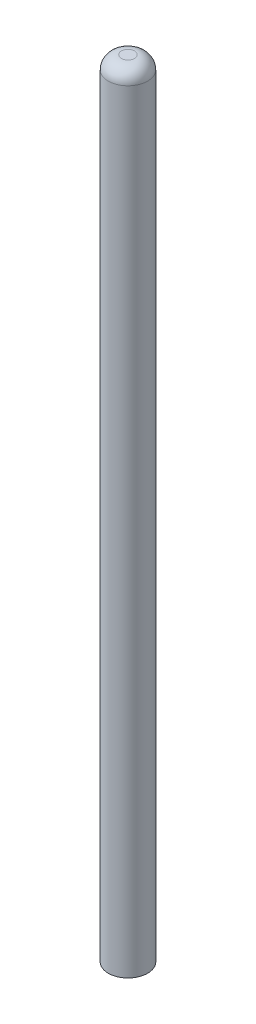
ISO-10303-21;
HEADER;
FILE_DESCRIPTION(('STEP AP214'),'2;1');
FILE_NAME('part.step','',(''),(''),'','','');
FILE_SCHEMA(('AUTOMOTIVE_DESIGN { 1 0 10303 214 1 1 1 1 }'));
ENDSEC;
DATA;
#1=APPLICATION_CONTEXT('core data for automotive mechanical design processes');
#2=APPLICATION_PROTOCOL_DEFINITION('international standard','automotive_design',2000,#1);
#3=PRODUCT_CONTEXT('',#1,'mechanical');
#4=PRODUCT('Part','Part','',(#3));
#5=PRODUCT_RELATED_PRODUCT_CATEGORY('part','',(#4));
#6=PRODUCT_DEFINITION_FORMATION('','',#4);
#7=PRODUCT_DEFINITION_CONTEXT('part definition',#1,'design');
#8=PRODUCT_DEFINITION('design','',#6,#7);
#9=PRODUCT_DEFINITION_SHAPE('','',#8);
#10=(LENGTH_UNIT() NAMED_UNIT(*) SI_UNIT(.MILLI.,.METRE.));
#11=(NAMED_UNIT(*) PLANE_ANGLE_UNIT() SI_UNIT($,.RADIAN.));
#12=(NAMED_UNIT(*) SI_UNIT($,.STERADIAN.) SOLID_ANGLE_UNIT());
#13=UNCERTAINTY_MEASURE_WITH_UNIT(LENGTH_MEASURE(1.E-05),#10,'distance_accuracy_value','');
#14=(GEOMETRIC_REPRESENTATION_CONTEXT(3) GLOBAL_UNCERTAINTY_ASSIGNED_CONTEXT((#13)) GLOBAL_UNIT_ASSIGNED_CONTEXT((#10,
#11,#12)) REPRESENTATION_CONTEXT('',''));
#15=CARTESIAN_POINT('',(0.,0.,0.));
#16=DIRECTION('',(0.,0.,1.));
#17=DIRECTION('',(1.,0.,0.));
#18=AXIS2_PLACEMENT_3D('',#15,#16,#17);
#19=CARTESIAN_POINT('',(0.,60.,0.));
#20=DIRECTION('',(0.,-1.,0.));
#21=DIRECTION('',(0.,0.,-1.));
#22=AXIS2_PLACEMENT_3D('',#19,#20,#21);
#23=CYLINDRICAL_SURFACE('',#22,1.5);
#24=CARTESIAN_POINT('',(0.,59.,0.));
#25=DIRECTION('',(0.,1.,0.));
#26=DIRECTION('',(0.,0.,1.));
#27=AXIS2_PLACEMENT_3D('',#24,#25,#26);
#28=CIRCLE('',#27,1.5);
#29=CARTESIAN_POINT('',(0.,59.,1.5));
#30=VERTEX_POINT('',#29);
#31=EDGE_CURVE('E10',#30,#30,#28,.F.);
#32=ORIENTED_EDGE('',*,*,#31,.T.);
#33=EDGE_LOOP('',(#32));
#34=FACE_BOUND('',#33,.T.);
#35=CARTESIAN_POINT('',(0.,0.,0.));
#36=DIRECTION('',(0.,1.,0.));
#37=DIRECTION('',(0.,0.,1.));
#38=AXIS2_PLACEMENT_3D('',#35,#36,#37);
#39=CIRCLE('',#38,1.5);
#40=CARTESIAN_POINT('',(0.,0.,1.5));
#41=VERTEX_POINT('',#40);
#42=EDGE_CURVE('E54',#41,#41,#39,.T.);
#43=ORIENTED_EDGE('',*,*,#42,.T.);
#44=EDGE_LOOP('',(#43));
#45=FACE_BOUND('',#44,.T.);
#46=ADVANCED_FACE('F41',(#34,#45),#23,.T.);
#47=CARTESIAN_POINT('',(0.,60.,0.));
#48=DIRECTION('',(0.,1.,0.));
#49=DIRECTION('',(0.,0.,1.));
#50=AXIS2_PLACEMENT_3D('',#47,#48,#49);
#51=PLANE('',#50);
#52=CARTESIAN_POINT('',(0.,60.,0.));
#53=DIRECTION('',(0.,1.,0.));
#54=DIRECTION('',(0.,0.,1.));
#55=AXIS2_PLACEMENT_3D('',#52,#53,#54);
#56=CIRCLE('',#55,0.5);
#57=CARTESIAN_POINT('',(0.,60.,0.5));
#58=VERTEX_POINT('',#57);
#59=EDGE_CURVE('E49',#58,#58,#56,.T.);
#60=ORIENTED_EDGE('',*,*,#59,.T.);
#61=EDGE_LOOP('',(#60));
#62=FACE_BOUND('',#61,.T.);
#63=ADVANCED_FACE('F65',(#62),#51,.T.);
#64=CARTESIAN_POINT('',(0.,0.,0.));
#65=DIRECTION('',(0.,1.,0.));
#66=DIRECTION('',(0.,0.,1.));
#67=AXIS2_PLACEMENT_3D('',#64,#65,#66);
#68=PLANE('',#67);
#69=ORIENTED_EDGE('',*,*,#42,.F.);
#70=EDGE_LOOP('',(#69));
#71=FACE_BOUND('',#70,.T.);
#72=ADVANCED_FACE('F63',(#71),#68,.F.);
#73=CARTESIAN_POINT('',(0.,59.,0.));
#74=DIRECTION('',(0.,1.,0.));
#75=DIRECTION('',(0.,0.,1.));
#76=AXIS2_PLACEMENT_3D('',#73,#74,#75);
#77=DEGENERATE_TOROIDAL_SURFACE('',#76,0.5,1.,.T.);
#78=ORIENTED_EDGE('',*,*,#31,.F.);
#79=EDGE_LOOP('',(#78));
#80=FACE_BOUND('',#79,.T.);
#81=ORIENTED_EDGE('',*,*,#59,.F.);
#82=EDGE_LOOP('',(#81));
#83=FACE_BOUND('',#82,.T.);
#84=ADVANCED_FACE('F43',(#80,#83),#77,.T.);
#85=CLOSED_SHELL('',(#46,#63,#72,#84));
#86=MANIFOLD_SOLID_BREP('B2',#85);
#87=ADVANCED_BREP_SHAPE_REPRESENTATION('',(#18,#86),#14);
#88=SHAPE_DEFINITION_REPRESENTATION(#9,#87);
ENDSEC;
END-ISO-10303-21;
